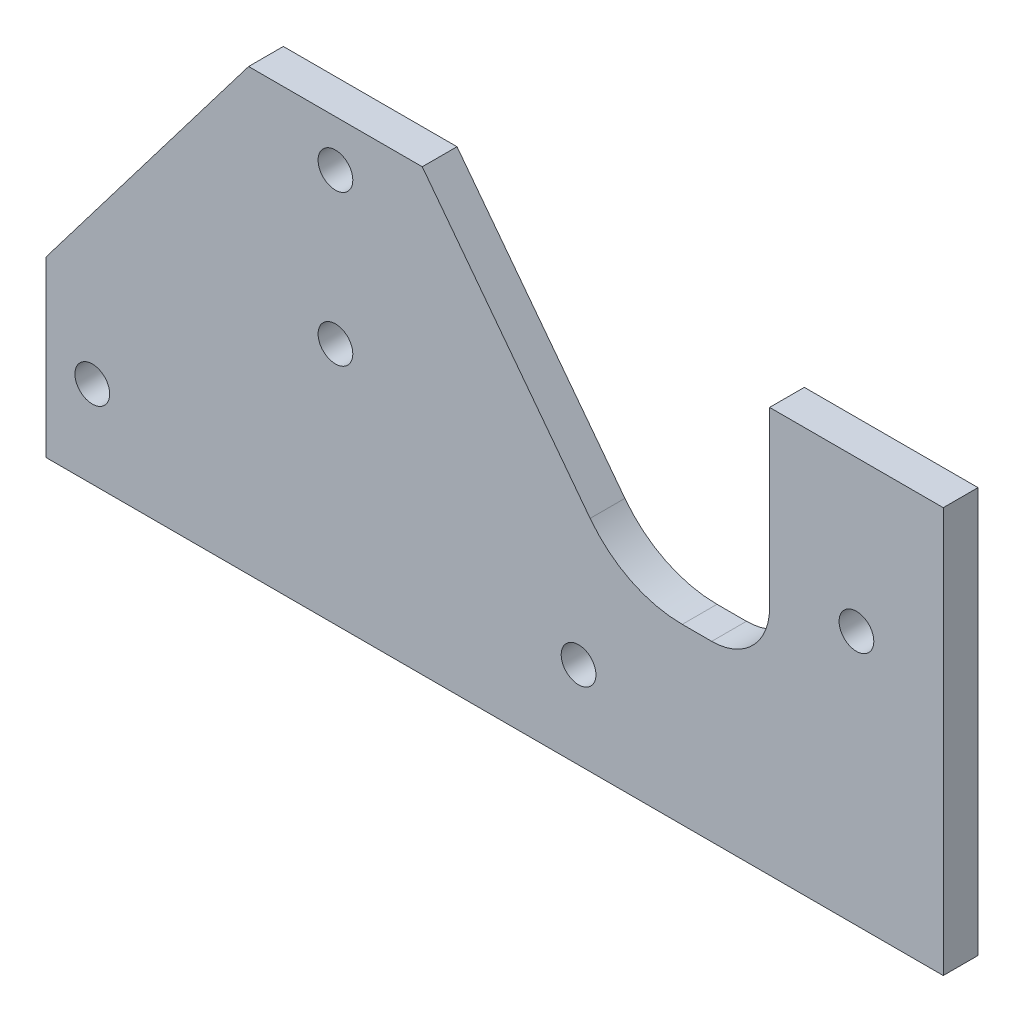
ISO-10303-21;
HEADER;
FILE_DESCRIPTION(('STEP AP214'),'2;1');
FILE_NAME('part.step','',(''),(''),'','','');
FILE_SCHEMA(('AUTOMOTIVE_DESIGN { 1 0 10303 214 1 1 1 1 }'));
ENDSEC;
DATA;
#1=APPLICATION_CONTEXT('core data for automotive mechanical design processes');
#2=APPLICATION_PROTOCOL_DEFINITION('international standard','automotive_design',2000,#1);
#3=PRODUCT_CONTEXT('',#1,'mechanical');
#4=PRODUCT('Part','Part','',(#3));
#5=PRODUCT_RELATED_PRODUCT_CATEGORY('part','',(#4));
#6=PRODUCT_DEFINITION_FORMATION('','',#4);
#7=PRODUCT_DEFINITION_CONTEXT('part definition',#1,'design');
#8=PRODUCT_DEFINITION('design','',#6,#7);
#9=PRODUCT_DEFINITION_SHAPE('','',#8);
#10=(LENGTH_UNIT() NAMED_UNIT(*) SI_UNIT(.MILLI.,.METRE.));
#11=(NAMED_UNIT(*) PLANE_ANGLE_UNIT() SI_UNIT($,.RADIAN.));
#12=(NAMED_UNIT(*) SI_UNIT($,.STERADIAN.) SOLID_ANGLE_UNIT());
#13=UNCERTAINTY_MEASURE_WITH_UNIT(LENGTH_MEASURE(1.E-05),#10,'distance_accuracy_value','');
#14=(GEOMETRIC_REPRESENTATION_CONTEXT(3) GLOBAL_UNCERTAINTY_ASSIGNED_CONTEXT((#13)) GLOBAL_UNIT_ASSIGNED_CONTEXT((#10,
#11,#12)) REPRESENTATION_CONTEXT('',''));
#15=CARTESIAN_POINT('',(0.,0.,0.));
#16=DIRECTION('',(0.,0.,1.));
#17=DIRECTION('',(1.,0.,0.));
#18=AXIS2_PLACEMENT_3D('',#15,#16,#17);
#19=CARTESIAN_POINT('',(-17.5,-23.,3.));
#20=DIRECTION('',(0.795828694120859,-0.605521832483262,0.));
#21=DIRECTION('',(0.605521832483262,0.795828694120859,0.));
#22=AXIS2_PLACEMENT_3D('',#19,#20,#21);
#23=PLANE('',#22);
#24=DIRECTION('',(-0.605521832483262,-0.795828694120859,0.));
#25=VECTOR('',#24,1.);
#26=CARTESIAN_POINT('',(-17.5,-23.,0.));
#27=LINE('',#26,#25);
#28=CARTESIAN_POINT('',(0.,0.,0.));
#29=VERTEX_POINT('',#28);
#30=CARTESIAN_POINT('',(-17.5,-23.,0.));
#31=VERTEX_POINT('',#30);
#32=EDGE_CURVE('E151',#29,#31,#27,.T.);
#33=ORIENTED_EDGE('',*,*,#32,.T.);
#34=DIRECTION('',(0.,0.,-1.));
#35=VECTOR('',#34,1.);
#36=CARTESIAN_POINT('',(-17.5,-23.,3.));
#37=LINE('',#36,#35);
#38=CARTESIAN_POINT('',(-17.5,-23.,3.));
#39=VERTEX_POINT('',#38);
#40=EDGE_CURVE('E11',#39,#31,#37,.T.);
#41=ORIENTED_EDGE('',*,*,#40,.F.);
#42=DIRECTION('',(-0.605521832483262,-0.795828694120859,0.));
#43=VECTOR('',#42,1.);
#44=CARTESIAN_POINT('',(-17.5,-23.,3.));
#45=LINE('',#44,#43);
#46=CARTESIAN_POINT('',(0.,0.,3.));
#47=VERTEX_POINT('',#46);
#48=EDGE_CURVE('E172',#47,#39,#45,.T.);
#49=ORIENTED_EDGE('',*,*,#48,.F.);
#50=DIRECTION('',(0.,0.,-1.));
#51=VECTOR('',#50,1.);
#52=CARTESIAN_POINT('',(0.,0.,3.));
#53=LINE('',#52,#51);
#54=EDGE_CURVE('E147',#47,#29,#53,.T.);
#55=ORIENTED_EDGE('',*,*,#54,.T.);
#56=EDGE_LOOP('',(#33,#41,#49,#55));
#57=FACE_BOUND('',#56,.T.);
#58=ADVANCED_FACE('F37',(#57),#23,.F.);
#59=CARTESIAN_POINT('',(-17.5,-38.,3.));
#60=DIRECTION('',(1.,0.,0.));
#61=DIRECTION('',(0.,0.,-1.));
#62=AXIS2_PLACEMENT_3D('',#59,#60,#61);
#63=PLANE('',#62);
#64=DIRECTION('',(0.,-1.,0.));
#65=VECTOR('',#64,1.);
#66=CARTESIAN_POINT('',(-17.5,-38.,0.));
#67=LINE('',#66,#65);
#68=CARTESIAN_POINT('',(-17.5,-38.,0.));
#69=VERTEX_POINT('',#68);
#70=EDGE_CURVE('E154',#31,#69,#67,.T.);
#71=ORIENTED_EDGE('',*,*,#70,.T.);
#72=DIRECTION('',(0.,0.,-1.));
#73=VECTOR('',#72,1.);
#74=CARTESIAN_POINT('',(-17.5,-38.,3.));
#75=LINE('',#74,#73);
#76=CARTESIAN_POINT('',(-17.5,-38.,3.));
#77=VERTEX_POINT('',#76);
#78=EDGE_CURVE('E45',#77,#69,#75,.T.);
#79=ORIENTED_EDGE('',*,*,#78,.F.);
#80=DIRECTION('',(0.,-1.,0.));
#81=VECTOR('',#80,1.);
#82=CARTESIAN_POINT('',(-17.5,-38.,3.));
#83=LINE('',#82,#81);
#84=EDGE_CURVE('E105',#39,#77,#83,.T.);
#85=ORIENTED_EDGE('',*,*,#84,.F.);
#86=ORIENTED_EDGE('',*,*,#40,.T.);
#87=EDGE_LOOP('',(#71,#79,#85,#86));
#88=FACE_BOUND('',#87,.T.);
#89=ADVANCED_FACE('F245',(#88),#63,.F.);
#90=CARTESIAN_POINT('',(60.,-38.,3.));
#91=DIRECTION('',(0.,1.,0.));
#92=DIRECTION('',(-1.,0.,0.));
#93=AXIS2_PLACEMENT_3D('',#90,#91,#92);
#94=PLANE('',#93);
#95=DIRECTION('',(1.,0.,0.));
#96=VECTOR('',#95,1.);
#97=CARTESIAN_POINT('',(60.,-38.,0.));
#98=LINE('',#97,#96);
#99=CARTESIAN_POINT('',(60.,-38.,0.));
#100=VERTEX_POINT('',#99);
#101=EDGE_CURVE('E157',#69,#100,#98,.T.);
#102=ORIENTED_EDGE('',*,*,#101,.T.);
#103=DIRECTION('',(0.,0.,-1.));
#104=VECTOR('',#103,1.);
#105=CARTESIAN_POINT('',(60.,-38.,3.));
#106=LINE('',#105,#104);
#107=CARTESIAN_POINT('',(60.,-38.,3.));
#108=VERTEX_POINT('',#107);
#109=EDGE_CURVE('E188',#108,#100,#106,.T.);
#110=ORIENTED_EDGE('',*,*,#109,.F.);
#111=DIRECTION('',(1.,0.,0.));
#112=VECTOR('',#111,1.);
#113=CARTESIAN_POINT('',(60.,-38.,3.));
#114=LINE('',#113,#112);
#115=EDGE_CURVE('E196',#77,#108,#114,.T.);
#116=ORIENTED_EDGE('',*,*,#115,.F.);
#117=ORIENTED_EDGE('',*,*,#78,.T.);
#118=EDGE_LOOP('',(#102,#110,#116,#117));
#119=FACE_BOUND('',#118,.T.);
#120=ADVANCED_FACE('F194',(#119),#94,.F.);
#121=CARTESIAN_POINT('',(60.,-3.,3.));
#122=DIRECTION('',(-1.,0.,0.));
#123=DIRECTION('',(0.,-1.,0.));
#124=AXIS2_PLACEMENT_3D('',#121,#122,#123);
#125=PLANE('',#124);
#126=DIRECTION('',(0.,1.,0.));
#127=VECTOR('',#126,1.);
#128=CARTESIAN_POINT('',(60.,-3.,0.));
#129=LINE('',#128,#127);
#130=CARTESIAN_POINT('',(60.,-3.,0.));
#131=VERTEX_POINT('',#130);
#132=EDGE_CURVE('E159',#100,#131,#129,.T.);
#133=ORIENTED_EDGE('',*,*,#132,.T.);
#134=DIRECTION('',(0.,0.,-1.));
#135=VECTOR('',#134,1.);
#136=CARTESIAN_POINT('',(60.,-3.,3.));
#137=LINE('',#136,#135);
#138=CARTESIAN_POINT('',(60.,-3.,3.));
#139=VERTEX_POINT('',#138);
#140=EDGE_CURVE('E185',#139,#131,#137,.T.);
#141=ORIENTED_EDGE('',*,*,#140,.F.);
#142=DIRECTION('',(0.,1.,0.));
#143=VECTOR('',#142,1.);
#144=CARTESIAN_POINT('',(60.,-3.,3.));
#145=LINE('',#144,#143);
#146=EDGE_CURVE('E214',#108,#139,#145,.T.);
#147=ORIENTED_EDGE('',*,*,#146,.F.);
#148=ORIENTED_EDGE('',*,*,#109,.T.);
#149=EDGE_LOOP('',(#133,#141,#147,#148));
#150=FACE_BOUND('',#149,.T.);
#151=ADVANCED_FACE('F205',(#150),#125,.F.);
#152=CARTESIAN_POINT('',(45.,-3.,3.));
#153=DIRECTION('',(0.,-1.,0.));
#154=DIRECTION('',(0.,0.,-1.));
#155=AXIS2_PLACEMENT_3D('',#152,#153,#154);
#156=PLANE('',#155);
#157=DIRECTION('',(-1.,0.,0.));
#158=VECTOR('',#157,1.);
#159=CARTESIAN_POINT('',(45.,-3.,0.));
#160=LINE('',#159,#158);
#161=CARTESIAN_POINT('',(45.,-3.,0.));
#162=VERTEX_POINT('',#161);
#163=EDGE_CURVE('E161',#131,#162,#160,.T.);
#164=ORIENTED_EDGE('',*,*,#163,.T.);
#165=DIRECTION('',(0.,0.,-1.));
#166=VECTOR('',#165,1.);
#167=CARTESIAN_POINT('',(45.,-3.,3.));
#168=LINE('',#167,#166);
#169=CARTESIAN_POINT('',(45.,-3.,3.));
#170=VERTEX_POINT('',#169);
#171=EDGE_CURVE('E182',#170,#162,#168,.T.);
#172=ORIENTED_EDGE('',*,*,#171,.F.);
#173=DIRECTION('',(-1.,0.,0.));
#174=VECTOR('',#173,1.);
#175=CARTESIAN_POINT('',(45.,-3.,3.));
#176=LINE('',#175,#174);
#177=EDGE_CURVE('E211',#139,#170,#176,.T.);
#178=ORIENTED_EDGE('',*,*,#177,.F.);
#179=ORIENTED_EDGE('',*,*,#140,.T.);
#180=EDGE_LOOP('',(#164,#172,#178,#179));
#181=FACE_BOUND('',#180,.T.);
#182=ADVANCED_FACE('F209',(#181),#156,.F.);
#183=CARTESIAN_POINT('',(45.,-18.,3.));
#184=DIRECTION('',(1.,0.,0.));
#185=DIRECTION('',(0.,1.,0.));
#186=AXIS2_PLACEMENT_3D('',#183,#184,#185);
#187=PLANE('',#186);
#188=DIRECTION('',(0.,-1.,0.));
#189=VECTOR('',#188,1.);
#190=CARTESIAN_POINT('',(45.,-18.,0.));
#191=LINE('',#190,#189);
#192=CARTESIAN_POINT('',(45.,-18.,0.));
#193=VERTEX_POINT('',#192);
#194=EDGE_CURVE('E163',#162,#193,#191,.T.);
#195=ORIENTED_EDGE('',*,*,#194,.T.);
#196=DIRECTION('',(0.,0.,-1.));
#197=VECTOR('',#196,1.);
#198=CARTESIAN_POINT('',(45.,-18.,3.));
#199=LINE('',#198,#197);
#200=CARTESIAN_POINT('',(45.,-18.,3.));
#201=VERTEX_POINT('',#200);
#202=EDGE_CURVE('E179',#201,#193,#199,.T.);
#203=ORIENTED_EDGE('',*,*,#202,.F.);
#204=DIRECTION('',(0.,-1.,0.));
#205=VECTOR('',#204,1.);
#206=CARTESIAN_POINT('',(45.,-18.,3.));
#207=LINE('',#206,#205);
#208=EDGE_CURVE('E213',#170,#201,#207,.T.);
#209=ORIENTED_EDGE('',*,*,#208,.F.);
#210=ORIENTED_EDGE('',*,*,#171,.T.);
#211=EDGE_LOOP('',(#195,#203,#209,#210));
#212=FACE_BOUND('',#211,.T.);
#213=ADVANCED_FACE('F258',(#212),#187,.F.);
#214=CARTESIAN_POINT('',(40.,-18.,3.));
#215=DIRECTION('',(0.,0.,-1.));
#216=DIRECTION('',(-1.,0.,0.));
#217=AXIS2_PLACEMENT_3D('',#214,#215,#216);
#218=CYLINDRICAL_SURFACE('',#217,5.);
#219=CARTESIAN_POINT('',(40.,-18.,0.));
#220=DIRECTION('',(0.,0.,-1.));
#221=DIRECTION('',(1.,0.,0.));
#222=AXIS2_PLACEMENT_3D('',#219,#220,#221);
#223=CIRCLE('',#222,5.);
#224=CARTESIAN_POINT('',(40.,-23.,0.));
#225=VERTEX_POINT('',#224);
#226=EDGE_CURVE('E165',#193,#225,#223,.T.);
#227=ORIENTED_EDGE('',*,*,#226,.T.);
#228=DIRECTION('',(0.,0.,-1.));
#229=VECTOR('',#228,1.);
#230=CARTESIAN_POINT('',(40.,-23.,3.));
#231=LINE('',#230,#229);
#232=CARTESIAN_POINT('',(40.,-23.,3.));
#233=VERTEX_POINT('',#232);
#234=EDGE_CURVE('E176',#233,#225,#231,.T.);
#235=ORIENTED_EDGE('',*,*,#234,.F.);
#236=CARTESIAN_POINT('',(40.,-18.,3.));
#237=DIRECTION('',(0.,0.,-1.));
#238=DIRECTION('',(1.,0.,0.));
#239=AXIS2_PLACEMENT_3D('',#236,#237,#238);
#240=CIRCLE('',#239,5.);
#241=EDGE_CURVE('E216',#201,#233,#240,.T.);
#242=ORIENTED_EDGE('',*,*,#241,.F.);
#243=ORIENTED_EDGE('',*,*,#202,.T.);
#244=EDGE_LOOP('',(#227,#235,#242,#243));
#245=FACE_BOUND('',#244,.T.);
#246=ADVANCED_FACE('F225',(#245),#218,.F.);
#247=CARTESIAN_POINT('',(37.4568226231465,-23.,3.));
#248=DIRECTION('',(0.,-1.,0.));
#249=DIRECTION('',(0.,0.,-1.));
#250=AXIS2_PLACEMENT_3D('',#247,#248,#249);
#251=PLANE('',#250);
#252=DIRECTION('',(-1.,0.,0.));
#253=VECTOR('',#252,1.);
#254=CARTESIAN_POINT('',(37.4568226231465,-23.,0.));
#255=LINE('',#254,#253);
#256=CARTESIAN_POINT('',(37.4568226231465,-23.,0.));
#257=VERTEX_POINT('',#256);
#258=EDGE_CURVE('E167',#225,#257,#255,.T.);
#259=ORIENTED_EDGE('',*,*,#258,.T.);
#260=DIRECTION('',(0.,0.,-1.));
#261=VECTOR('',#260,1.);
#262=CARTESIAN_POINT('',(37.4568226231465,-23.,3.));
#263=LINE('',#262,#261);
#264=CARTESIAN_POINT('',(37.4568226231465,-23.,3.));
#265=VERTEX_POINT('',#264);
#266=EDGE_CURVE('E142',#265,#257,#263,.T.);
#267=ORIENTED_EDGE('',*,*,#266,.F.);
#268=DIRECTION('',(-1.,0.,0.));
#269=VECTOR('',#268,1.);
#270=CARTESIAN_POINT('',(37.4568226231465,-23.,3.));
#271=LINE('',#270,#269);
#272=EDGE_CURVE('E133',#233,#265,#271,.T.);
#273=ORIENTED_EDGE('',*,*,#272,.F.);
#274=ORIENTED_EDGE('',*,*,#234,.T.);
#275=EDGE_LOOP('',(#259,#267,#273,#274));
#276=FACE_BOUND('',#275,.T.);
#277=ADVANCED_FACE('F229',(#276),#251,.F.);
#278=CARTESIAN_POINT('',(37.4568226231465,-13.,3.));
#279=DIRECTION('',(0.,0.,-1.));
#280=DIRECTION('',(-1.,0.,0.));
#281=AXIS2_PLACEMENT_3D('',#278,#279,#280);
#282=CYLINDRICAL_SURFACE('',#281,10.);
#283=CARTESIAN_POINT('',(37.4568226231465,-13.,0.));
#284=DIRECTION('',(0.,0.,-1.));
#285=DIRECTION('',(1.,0.,0.));
#286=AXIS2_PLACEMENT_3D('',#283,#284,#285);
#287=CIRCLE('',#286,10.);
#288=CARTESIAN_POINT('',(29.4985356819378,-19.0552183248326,0.));
#289=VERTEX_POINT('',#288);
#290=EDGE_CURVE('E141',#257,#289,#287,.T.);
#291=ORIENTED_EDGE('',*,*,#290,.T.);
#292=DIRECTION('',(0.,0.,-1.));
#293=VECTOR('',#292,1.);
#294=CARTESIAN_POINT('',(29.4985356819378,-19.0552183248326,3.));
#295=LINE('',#294,#293);
#296=CARTESIAN_POINT('',(29.4985356819378,-19.0552183248326,3.));
#297=VERTEX_POINT('',#296);
#298=EDGE_CURVE('E138',#297,#289,#295,.T.);
#299=ORIENTED_EDGE('',*,*,#298,.F.);
#300=CARTESIAN_POINT('',(37.4568226231465,-13.,3.));
#301=DIRECTION('',(0.,0.,-1.));
#302=DIRECTION('',(1.,0.,0.));
#303=AXIS2_PLACEMENT_3D('',#300,#301,#302);
#304=CIRCLE('',#303,10.);
#305=EDGE_CURVE('E127',#265,#297,#304,.T.);
#306=ORIENTED_EDGE('',*,*,#305,.F.);
#307=ORIENTED_EDGE('',*,*,#266,.T.);
#308=EDGE_LOOP('',(#291,#299,#306,#307));
#309=FACE_BOUND('',#308,.T.);
#310=ADVANCED_FACE('F139',(#309),#282,.F.);
#311=CARTESIAN_POINT('',(15.,0.,3.));
#312=DIRECTION('',(-0.795828694120859,-0.605521832483263,0.));
#313=DIRECTION('',(0.605521832483263,-0.795828694120859,0.));
#314=AXIS2_PLACEMENT_3D('',#311,#312,#313);
#315=PLANE('',#314);
#316=DIRECTION('',(-0.605521832483263,0.795828694120859,0.));
#317=VECTOR('',#316,1.);
#318=CARTESIAN_POINT('',(15.,0.,0.));
#319=LINE('',#318,#317);
#320=CARTESIAN_POINT('',(15.,0.,0.));
#321=VERTEX_POINT('',#320);
#322=EDGE_CURVE('E91',#289,#321,#319,.T.);
#323=ORIENTED_EDGE('',*,*,#322,.T.);
#324=DIRECTION('',(0.,0.,-1.));
#325=VECTOR('',#324,1.);
#326=CARTESIAN_POINT('',(15.,0.,3.));
#327=LINE('',#326,#325);
#328=CARTESIAN_POINT('',(15.,0.,3.));
#329=VERTEX_POINT('',#328);
#330=EDGE_CURVE('E143',#329,#321,#327,.T.);
#331=ORIENTED_EDGE('',*,*,#330,.F.);
#332=DIRECTION('',(-0.605521832483263,0.795828694120859,0.));
#333=VECTOR('',#332,1.);
#334=CARTESIAN_POINT('',(15.,0.,3.));
#335=LINE('',#334,#333);
#336=EDGE_CURVE('E131',#297,#329,#335,.T.);
#337=ORIENTED_EDGE('',*,*,#336,.F.);
#338=ORIENTED_EDGE('',*,*,#298,.T.);
#339=EDGE_LOOP('',(#323,#331,#337,#338));
#340=FACE_BOUND('',#339,.T.);
#341=ADVANCED_FACE('F145',(#340),#315,.F.);
#342=CARTESIAN_POINT('',(0.,0.,3.));
#343=DIRECTION('',(0.,-1.,0.));
#344=DIRECTION('',(0.,0.,-1.));
#345=AXIS2_PLACEMENT_3D('',#342,#343,#344);
#346=PLANE('',#345);
#347=DIRECTION('',(-1.,0.,0.));
#348=VECTOR('',#347,1.);
#349=CARTESIAN_POINT('',(0.,0.,0.));
#350=LINE('',#349,#348);
#351=EDGE_CURVE('E97',#321,#29,#350,.T.);
#352=ORIENTED_EDGE('',*,*,#351,.T.);
#353=ORIENTED_EDGE('',*,*,#54,.F.);
#354=DIRECTION('',(-1.,0.,0.));
#355=VECTOR('',#354,1.);
#356=CARTESIAN_POINT('',(0.,0.,3.));
#357=LINE('',#356,#355);
#358=EDGE_CURVE('E53',#329,#47,#357,.T.);
#359=ORIENTED_EDGE('',*,*,#358,.F.);
#360=ORIENTED_EDGE('',*,*,#330,.T.);
#361=EDGE_LOOP('',(#352,#353,#359,#360));
#362=FACE_BOUND('',#361,.T.);
#363=ADVANCED_FACE('F233',(#362),#346,.F.);
#364=CARTESIAN_POINT('',(37.4568226231465,-13.,3.));
#365=DIRECTION('',(0.,0.,1.));
#366=DIRECTION('',(1.,0.,0.));
#367=AXIS2_PLACEMENT_3D('',#364,#365,#366);
#368=PLANE('',#367);
#369=CARTESIAN_POINT('',(-13.5,-30.5,3.));
#370=DIRECTION('',(0.,0.,1.));
#371=DIRECTION('',(1.,0.,0.));
#372=AXIS2_PLACEMENT_3D('',#369,#370,#371);
#373=CIRCLE('',#372,1.5);
#374=CARTESIAN_POINT('',(-12.,-30.5,3.));
#375=VERTEX_POINT('',#374);
#376=EDGE_CURVE('E352',#375,#375,#373,.T.);
#377=ORIENTED_EDGE('',*,*,#376,.F.);
#378=EDGE_LOOP('',(#377));
#379=FACE_BOUND('',#378,.T.);
#380=CARTESIAN_POINT('',(52.5,-16.,3.));
#381=DIRECTION('',(0.,0.,1.));
#382=DIRECTION('',(1.,0.,0.));
#383=AXIS2_PLACEMENT_3D('',#380,#381,#382);
#384=CIRCLE('',#383,1.5);
#385=CARTESIAN_POINT('',(54.,-16.,3.));
#386=VERTEX_POINT('',#385);
#387=EDGE_CURVE('E370',#386,#386,#384,.T.);
#388=ORIENTED_EDGE('',*,*,#387,.F.);
#389=EDGE_LOOP('',(#388));
#390=FACE_BOUND('',#389,.T.);
#391=CARTESIAN_POINT('',(7.5,-17.,3.));
#392=DIRECTION('',(0.,0.,1.));
#393=DIRECTION('',(1.,0.,0.));
#394=AXIS2_PLACEMENT_3D('',#391,#392,#393);
#395=CIRCLE('',#394,1.5);
#396=CARTESIAN_POINT('',(9.,-17.,3.));
#397=VERTEX_POINT('',#396);
#398=EDGE_CURVE('E364',#397,#397,#395,.T.);
#399=ORIENTED_EDGE('',*,*,#398,.F.);
#400=EDGE_LOOP('',(#399));
#401=FACE_BOUND('',#400,.T.);
#402=CARTESIAN_POINT('',(7.5,-4.,3.));
#403=DIRECTION('',(0.,0.,1.));
#404=DIRECTION('',(1.,0.,0.));
#405=AXIS2_PLACEMENT_3D('',#402,#403,#404);
#406=CIRCLE('',#405,1.5);
#407=CARTESIAN_POINT('',(9.,-4.,3.));
#408=VERTEX_POINT('',#407);
#409=EDGE_CURVE('E363',#408,#408,#406,.T.);
#410=ORIENTED_EDGE('',*,*,#409,.F.);
#411=EDGE_LOOP('',(#410));
#412=FACE_BOUND('',#411,.T.);
#413=CARTESIAN_POINT('',(28.5,-30.5,3.));
#414=DIRECTION('',(0.,0.,1.));
#415=DIRECTION('',(1.,0.,0.));
#416=AXIS2_PLACEMENT_3D('',#413,#414,#415);
#417=CIRCLE('',#416,1.5);
#418=CARTESIAN_POINT('',(30.,-30.5,3.));
#419=VERTEX_POINT('',#418);
#420=EDGE_CURVE('E357',#419,#419,#417,.T.);
#421=ORIENTED_EDGE('',*,*,#420,.F.);
#422=EDGE_LOOP('',(#421));
#423=FACE_BOUND('',#422,.T.);
#424=ORIENTED_EDGE('',*,*,#48,.T.);
#425=ORIENTED_EDGE('',*,*,#84,.T.);
#426=ORIENTED_EDGE('',*,*,#115,.T.);
#427=ORIENTED_EDGE('',*,*,#146,.T.);
#428=ORIENTED_EDGE('',*,*,#177,.T.);
#429=ORIENTED_EDGE('',*,*,#208,.T.);
#430=ORIENTED_EDGE('',*,*,#241,.T.);
#431=ORIENTED_EDGE('',*,*,#272,.T.);
#432=ORIENTED_EDGE('',*,*,#305,.T.);
#433=ORIENTED_EDGE('',*,*,#336,.T.);
#434=ORIENTED_EDGE('',*,*,#358,.T.);
#435=EDGE_LOOP('',(#424,#425,#426,#427,#428,#429,#430,#431,#432,#433,#434));
#436=FACE_BOUND('',#435,.T.);
#437=ADVANCED_FACE('F129',(#379,#390,#401,#412,#423,#436),#368,.T.);
#438=CARTESIAN_POINT('',(37.4568226231465,-13.,0.));
#439=DIRECTION('',(0.,0.,1.));
#440=DIRECTION('',(1.,0.,0.));
#441=AXIS2_PLACEMENT_3D('',#438,#439,#440);
#442=PLANE('',#441);
#443=CARTESIAN_POINT('',(-13.5,-30.5,0.));
#444=DIRECTION('',(0.,0.,1.));
#445=DIRECTION('',(1.,0.,0.));
#446=AXIS2_PLACEMENT_3D('',#443,#444,#445);
#447=CIRCLE('',#446,1.5);
#448=CARTESIAN_POINT('',(-12.,-30.5,0.));
#449=VERTEX_POINT('',#448);
#450=EDGE_CURVE('E155',#449,#449,#447,.T.);
#451=ORIENTED_EDGE('',*,*,#450,.T.);
#452=EDGE_LOOP('',(#451));
#453=FACE_BOUND('',#452,.T.);
#454=CARTESIAN_POINT('',(52.5,-16.,0.));
#455=DIRECTION('',(0.,0.,1.));
#456=DIRECTION('',(1.,0.,0.));
#457=AXIS2_PLACEMENT_3D('',#454,#455,#456);
#458=CIRCLE('',#457,1.5);
#459=CARTESIAN_POINT('',(54.,-16.,0.));
#460=VERTEX_POINT('',#459);
#461=EDGE_CURVE('E367',#460,#460,#458,.T.);
#462=ORIENTED_EDGE('',*,*,#461,.T.);
#463=EDGE_LOOP('',(#462));
#464=FACE_BOUND('',#463,.T.);
#465=CARTESIAN_POINT('',(7.5,-17.,0.));
#466=DIRECTION('',(0.,0.,1.));
#467=DIRECTION('',(1.,0.,0.));
#468=AXIS2_PLACEMENT_3D('',#465,#466,#467);
#469=CIRCLE('',#468,1.5);
#470=CARTESIAN_POINT('',(9.,-17.,0.));
#471=VERTEX_POINT('',#470);
#472=EDGE_CURVE('E360',#471,#471,#469,.T.);
#473=ORIENTED_EDGE('',*,*,#472,.T.);
#474=EDGE_LOOP('',(#473));
#475=FACE_BOUND('',#474,.T.);
#476=CARTESIAN_POINT('',(7.5,-4.,0.));
#477=DIRECTION('',(0.,0.,1.));
#478=DIRECTION('',(1.,0.,0.));
#479=AXIS2_PLACEMENT_3D('',#476,#477,#478);
#480=CIRCLE('',#479,1.5);
#481=CARTESIAN_POINT('',(9.,-4.,0.));
#482=VERTEX_POINT('',#481);
#483=EDGE_CURVE('E375',#482,#482,#480,.T.);
#484=ORIENTED_EDGE('',*,*,#483,.T.);
#485=EDGE_LOOP('',(#484));
#486=FACE_BOUND('',#485,.T.);
#487=CARTESIAN_POINT('',(28.5,-30.5,0.));
#488=DIRECTION('',(0.,0.,1.));
#489=DIRECTION('',(1.,0.,0.));
#490=AXIS2_PLACEMENT_3D('',#487,#488,#489);
#491=CIRCLE('',#490,1.5);
#492=CARTESIAN_POINT('',(30.,-30.5,0.));
#493=VERTEX_POINT('',#492);
#494=EDGE_CURVE('E353',#493,#493,#491,.T.);
#495=ORIENTED_EDGE('',*,*,#494,.T.);
#496=EDGE_LOOP('',(#495));
#497=FACE_BOUND('',#496,.T.);
#498=ORIENTED_EDGE('',*,*,#32,.F.);
#499=ORIENTED_EDGE('',*,*,#351,.F.);
#500=ORIENTED_EDGE('',*,*,#322,.F.);
#501=ORIENTED_EDGE('',*,*,#290,.F.);
#502=ORIENTED_EDGE('',*,*,#258,.F.);
#503=ORIENTED_EDGE('',*,*,#226,.F.);
#504=ORIENTED_EDGE('',*,*,#194,.F.);
#505=ORIENTED_EDGE('',*,*,#163,.F.);
#506=ORIENTED_EDGE('',*,*,#132,.F.);
#507=ORIENTED_EDGE('',*,*,#101,.F.);
#508=ORIENTED_EDGE('',*,*,#70,.F.);
#509=EDGE_LOOP('',(#498,#499,#500,#501,#502,#503,#504,#505,#506,#507,#508));
#510=FACE_BOUND('',#509,.T.);
#511=ADVANCED_FACE('F200',(#453,#464,#475,#486,#497,#510),#442,.F.);
#512=CARTESIAN_POINT('',(28.5,-30.5,0.));
#513=DIRECTION('',(0.,0.,1.));
#514=DIRECTION('',(1.,0.,0.));
#515=AXIS2_PLACEMENT_3D('',#512,#513,#514);
#516=CYLINDRICAL_SURFACE('',#515,1.5);
#517=ORIENTED_EDGE('',*,*,#494,.F.);
#518=EDGE_LOOP('',(#517));
#519=FACE_BOUND('',#518,.T.);
#520=ORIENTED_EDGE('',*,*,#420,.T.);
#521=EDGE_LOOP('',(#520));
#522=FACE_BOUND('',#521,.T.);
#523=ADVANCED_FACE('F294',(#519,#522),#516,.F.);
#524=CARTESIAN_POINT('',(7.5,-4.,0.));
#525=DIRECTION('',(0.,0.,1.));
#526=DIRECTION('',(1.,0.,0.));
#527=AXIS2_PLACEMENT_3D('',#524,#525,#526);
#528=CYLINDRICAL_SURFACE('',#527,1.5);
#529=ORIENTED_EDGE('',*,*,#483,.F.);
#530=EDGE_LOOP('',(#529));
#531=FACE_BOUND('',#530,.T.);
#532=ORIENTED_EDGE('',*,*,#409,.T.);
#533=EDGE_LOOP('',(#532));
#534=FACE_BOUND('',#533,.T.);
#535=ADVANCED_FACE('F303',(#531,#534),#528,.F.);
#536=CARTESIAN_POINT('',(7.5,-17.,0.));
#537=DIRECTION('',(0.,0.,1.));
#538=DIRECTION('',(1.,0.,0.));
#539=AXIS2_PLACEMENT_3D('',#536,#537,#538);
#540=CYLINDRICAL_SURFACE('',#539,1.5);
#541=ORIENTED_EDGE('',*,*,#472,.F.);
#542=EDGE_LOOP('',(#541));
#543=FACE_BOUND('',#542,.T.);
#544=ORIENTED_EDGE('',*,*,#398,.T.);
#545=EDGE_LOOP('',(#544));
#546=FACE_BOUND('',#545,.T.);
#547=ADVANCED_FACE('F313',(#543,#546),#540,.F.);
#548=CARTESIAN_POINT('',(52.5,-16.,0.));
#549=DIRECTION('',(0.,0.,1.));
#550=DIRECTION('',(1.,0.,0.));
#551=AXIS2_PLACEMENT_3D('',#548,#549,#550);
#552=CYLINDRICAL_SURFACE('',#551,1.5);
#553=ORIENTED_EDGE('',*,*,#461,.F.);
#554=EDGE_LOOP('',(#553));
#555=FACE_BOUND('',#554,.T.);
#556=ORIENTED_EDGE('',*,*,#387,.T.);
#557=EDGE_LOOP('',(#556));
#558=FACE_BOUND('',#557,.T.);
#559=ADVANCED_FACE('F323',(#555,#558),#552,.F.);
#560=CARTESIAN_POINT('',(-13.5,-30.5,0.));
#561=DIRECTION('',(0.,0.,1.));
#562=DIRECTION('',(1.,0.,0.));
#563=AXIS2_PLACEMENT_3D('',#560,#561,#562);
#564=CYLINDRICAL_SURFACE('',#563,1.5);
#565=ORIENTED_EDGE('',*,*,#450,.F.);
#566=EDGE_LOOP('',(#565));
#567=FACE_BOUND('',#566,.T.);
#568=ORIENTED_EDGE('',*,*,#376,.T.);
#569=EDGE_LOOP('',(#568));
#570=FACE_BOUND('',#569,.T.);
#571=ADVANCED_FACE('F333',(#567,#570),#564,.F.);
#572=CLOSED_SHELL('',(#58,#89,#120,#151,#182,#213,#246,#277,#310,#341,#363,#437,#511,#523,#535,
#547,#559,#571));
#573=MANIFOLD_SOLID_BREP('B2',#572);
#574=ADVANCED_BREP_SHAPE_REPRESENTATION('',(#18,#573),#14);
#575=SHAPE_DEFINITION_REPRESENTATION(#9,#574);
ENDSEC;
END-ISO-10303-21;
